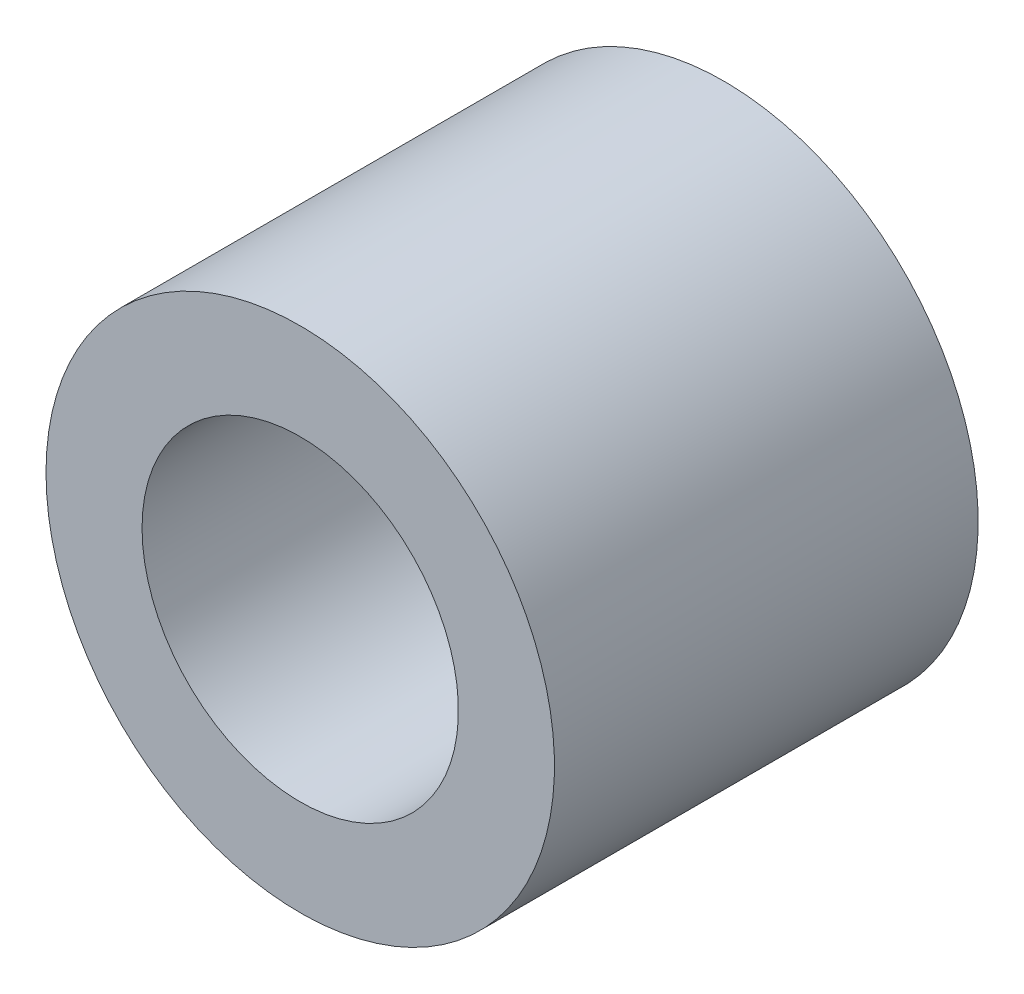
ISO-10303-21;
HEADER;
FILE_DESCRIPTION(('STEP AP214'),'2;1');
FILE_NAME('part.step','',(''),(''),'','','');
FILE_SCHEMA(('AUTOMOTIVE_DESIGN { 1 0 10303 214 1 1 1 1 }'));
ENDSEC;
DATA;
#1=APPLICATION_CONTEXT('core data for automotive mechanical design processes');
#2=APPLICATION_PROTOCOL_DEFINITION('international standard','automotive_design',2000,#1);
#3=PRODUCT_CONTEXT('',#1,'mechanical');
#4=PRODUCT('Part','Part','',(#3));
#5=PRODUCT_RELATED_PRODUCT_CATEGORY('part','',(#4));
#6=PRODUCT_DEFINITION_FORMATION('','',#4);
#7=PRODUCT_DEFINITION_CONTEXT('part definition',#1,'design');
#8=PRODUCT_DEFINITION('design','',#6,#7);
#9=PRODUCT_DEFINITION_SHAPE('','',#8);
#10=(LENGTH_UNIT() NAMED_UNIT(*) SI_UNIT(.MILLI.,.METRE.));
#11=(NAMED_UNIT(*) PLANE_ANGLE_UNIT() SI_UNIT($,.RADIAN.));
#12=(NAMED_UNIT(*) SI_UNIT($,.STERADIAN.) SOLID_ANGLE_UNIT());
#13=UNCERTAINTY_MEASURE_WITH_UNIT(LENGTH_MEASURE(1.E-05),#10,'distance_accuracy_value','');
#14=(GEOMETRIC_REPRESENTATION_CONTEXT(3) GLOBAL_UNCERTAINTY_ASSIGNED_CONTEXT((#13)) GLOBAL_UNIT_ASSIGNED_CONTEXT((#10,
#11,#12)) REPRESENTATION_CONTEXT('',''));
#15=CARTESIAN_POINT('',(0.,0.,0.));
#16=DIRECTION('',(0.,0.,1.));
#17=DIRECTION('',(1.,0.,0.));
#18=AXIS2_PLACEMENT_3D('',#15,#16,#17);
#19=CARTESIAN_POINT('',(0.,0.,9.525));
#20=DIRECTION('',(0.,0.,1.));
#21=DIRECTION('',(1.,0.,0.));
#22=AXIS2_PLACEMENT_3D('',#19,#20,#21);
#23=PLANE('',#22);
#24=CARTESIAN_POINT('',(0.,0.,9.525));
#25=DIRECTION('',(0.,0.,1.));
#26=DIRECTION('',(1.,0.,0.));
#27=AXIS2_PLACEMENT_3D('',#24,#25,#26);
#28=CIRCLE('',#27,5.715);
#29=CARTESIAN_POINT('',(-5.715,0.,9.525));
#30=VERTEX_POINT('',#29);
#31=EDGE_CURVE('E10',#30,#30,#28,.T.);
#32=ORIENTED_EDGE('',*,*,#31,.T.);
#33=EDGE_LOOP('',(#32));
#34=FACE_BOUND('',#33,.T.);
#35=CARTESIAN_POINT('',(0.,0.,9.525));
#36=DIRECTION('',(0.,0.,1.));
#37=DIRECTION('',(1.,0.,0.));
#38=AXIS2_PLACEMENT_3D('',#35,#36,#37);
#39=CIRCLE('',#38,3.556);
#40=CARTESIAN_POINT('',(-3.556,0.,9.525));
#41=VERTEX_POINT('',#40);
#42=EDGE_CURVE('E45',#41,#41,#39,.T.);
#43=ORIENTED_EDGE('',*,*,#42,.F.);
#44=EDGE_LOOP('',(#43));
#45=FACE_BOUND('',#44,.T.);
#46=ADVANCED_FACE('F34',(#34,#45),#23,.T.);
#47=CARTESIAN_POINT('',(0.,0.,0.));
#48=DIRECTION('',(0.,0.,1.));
#49=DIRECTION('',(1.,0.,0.));
#50=AXIS2_PLACEMENT_3D('',#47,#48,#49);
#51=PLANE('',#50);
#52=CARTESIAN_POINT('',(0.,0.,0.));
#53=DIRECTION('',(0.,0.,1.));
#54=DIRECTION('',(1.,0.,0.));
#55=AXIS2_PLACEMENT_3D('',#52,#53,#54);
#56=CIRCLE('',#55,5.715);
#57=CARTESIAN_POINT('',(-5.715,0.,0.));
#58=VERTEX_POINT('',#57);
#59=EDGE_CURVE('E38',#58,#58,#56,.T.);
#60=ORIENTED_EDGE('',*,*,#59,.F.);
#61=EDGE_LOOP('',(#60));
#62=FACE_BOUND('',#61,.T.);
#63=CARTESIAN_POINT('',(0.,0.,0.));
#64=DIRECTION('',(0.,0.,1.));
#65=DIRECTION('',(1.,0.,0.));
#66=AXIS2_PLACEMENT_3D('',#63,#64,#65);
#67=CIRCLE('',#66,3.556);
#68=CARTESIAN_POINT('',(-3.556,0.,0.));
#69=VERTEX_POINT('',#68);
#70=EDGE_CURVE('E47',#69,#69,#67,.T.);
#71=ORIENTED_EDGE('',*,*,#70,.T.);
#72=EDGE_LOOP('',(#71));
#73=FACE_BOUND('',#72,.T.);
#74=ADVANCED_FACE('F57',(#62,#73),#51,.F.);
#75=CARTESIAN_POINT('',(0.,0.,9.525));
#76=DIRECTION('',(0.,0.,-1.));
#77=DIRECTION('',(-1.,0.,0.));
#78=AXIS2_PLACEMENT_3D('',#75,#76,#77);
#79=CYLINDRICAL_SURFACE('',#78,5.715);
#80=CARTESIAN_POINT('',(-5.715,0.,9.525));
#81=CARTESIAN_POINT('',(-5.715,0.,9.42578125));
#82=CARTESIAN_POINT('',(-5.715,0.,9.3265625));
#83=CARTESIAN_POINT('',(-5.715,0.,9.128125));
#84=CARTESIAN_POINT('',(-5.715,0.,9.02890625));
#85=CARTESIAN_POINT('',(-5.715,0.,8.83046875));
#86=CARTESIAN_POINT('',(-5.715,0.,8.73125));
#87=CARTESIAN_POINT('',(-5.715,0.,8.5328125));
#88=CARTESIAN_POINT('',(-5.715,0.,8.43359375));
#89=CARTESIAN_POINT('',(-5.715,0.,8.23515625));
#90=CARTESIAN_POINT('',(-5.715,0.,8.1359375));
#91=CARTESIAN_POINT('',(-5.715,0.,7.9375));
#92=CARTESIAN_POINT('',(-5.715,0.,7.83828125));
#93=CARTESIAN_POINT('',(-5.715,0.,7.63984375));
#94=CARTESIAN_POINT('',(-5.715,0.,7.540625));
#95=CARTESIAN_POINT('',(-5.715,0.,7.3421875));
#96=CARTESIAN_POINT('',(-5.715,0.,7.24296875));
#97=CARTESIAN_POINT('',(-5.715,0.,7.04453125));
#98=CARTESIAN_POINT('',(-5.715,0.,6.9453125));
#99=CARTESIAN_POINT('',(-5.715,0.,6.746875));
#100=CARTESIAN_POINT('',(-5.715,0.,6.64765625));
#101=CARTESIAN_POINT('',(-5.715,0.,6.44921875));
#102=CARTESIAN_POINT('',(-5.715,0.,6.35));
#103=CARTESIAN_POINT('',(-5.715,0.,6.1515625));
#104=CARTESIAN_POINT('',(-5.715,0.,6.05234375));
#105=CARTESIAN_POINT('',(-5.715,0.,5.85390625));
#106=CARTESIAN_POINT('',(-5.715,0.,5.7546875));
#107=CARTESIAN_POINT('',(-5.715,0.,5.55625));
#108=CARTESIAN_POINT('',(-5.715,0.,5.45703125));
#109=CARTESIAN_POINT('',(-5.715,0.,5.25859375));
#110=CARTESIAN_POINT('',(-5.715,0.,5.159375));
#111=CARTESIAN_POINT('',(-5.715,0.,4.9609375));
#112=CARTESIAN_POINT('',(-5.715,0.,4.86171875));
#113=CARTESIAN_POINT('',(-5.715,0.,4.66328125));
#114=CARTESIAN_POINT('',(-5.715,0.,4.5640625));
#115=CARTESIAN_POINT('',(-5.715,0.,4.365625));
#116=CARTESIAN_POINT('',(-5.715,0.,4.26640625));
#117=CARTESIAN_POINT('',(-5.715,0.,4.06796875));
#118=CARTESIAN_POINT('',(-5.715,0.,3.96875));
#119=CARTESIAN_POINT('',(-5.715,0.,3.7703125));
#120=CARTESIAN_POINT('',(-5.715,0.,3.67109375));
#121=CARTESIAN_POINT('',(-5.715,0.,3.47265625));
#122=CARTESIAN_POINT('',(-5.715,0.,3.3734375));
#123=CARTESIAN_POINT('',(-5.715,0.,3.175));
#124=CARTESIAN_POINT('',(-5.715,0.,3.07578125));
#125=CARTESIAN_POINT('',(-5.715,0.,2.87734375));
#126=CARTESIAN_POINT('',(-5.715,0.,2.778125));
#127=CARTESIAN_POINT('',(-5.715,0.,2.5796875));
#128=CARTESIAN_POINT('',(-5.715,0.,2.48046875));
#129=CARTESIAN_POINT('',(-5.715,0.,2.28203125));
#130=CARTESIAN_POINT('',(-5.715,0.,2.1828125));
#131=CARTESIAN_POINT('',(-5.715,0.,1.984375));
#132=CARTESIAN_POINT('',(-5.715,0.,1.88515625));
#133=CARTESIAN_POINT('',(-5.715,0.,1.68671875));
#134=CARTESIAN_POINT('',(-5.715,0.,1.5875));
#135=CARTESIAN_POINT('',(-5.715,0.,1.3890625));
#136=CARTESIAN_POINT('',(-5.715,0.,1.28984375));
#137=CARTESIAN_POINT('',(-5.715,0.,1.09140625));
#138=CARTESIAN_POINT('',(-5.715,0.,0.992187500000001));
#139=CARTESIAN_POINT('',(-5.715,0.,0.793750000000001));
#140=CARTESIAN_POINT('',(-5.715,0.,0.69453125));
#141=CARTESIAN_POINT('',(-5.715,0.,0.49609375));
#142=CARTESIAN_POINT('',(-5.715,0.,0.396875));
#143=CARTESIAN_POINT('',(-5.715,0.,0.1984375));
#144=CARTESIAN_POINT('',(-5.715,0.,0.0992187500000001));
#145=CARTESIAN_POINT('',(-5.715,0.,0.));
#146=B_SPLINE_CURVE_WITH_KNOTS('',3,(#80,#81,#82,#83,#84,#85,#86,#87,#88,#89,#90,#91,#92,#93,
#94,#95,#96,#97,#98,#99,#100,#101,#102,#103,#104,#105,#106,#107,#108,#109,#110,#111,#112,#113,
#114,#115,#116,#117,#118,#119,#120,#121,#122,#123,#124,#125,#126,#127,#128,#129,#130,#131,#132,
#133,#134,#135,#136,#137,#138,#139,#140,#141,#142,#143,#144,#145),.UNSPECIFIED.,.F.,.F.,(4,2,2,
2,2,2,2,2,2,2,2,2,2,2,2,2,2,2,2,2,2,2,2,2,2,2,2,2,2,2,2,2,4),(0.,0.297656249999998,
0.595312499999999,0.892968749999999,1.190625,1.48828125,1.7859375,2.08359375,2.38125,2.67890625,
2.9765625,3.27421875,3.571875,3.86953125,4.1671875,4.46484375,4.7625,5.06015625,5.3578125,
5.65546875,5.953125,6.25078125,6.5484375,6.84609375,7.14375,7.44140625,7.7390625,8.03671875,
8.334375,8.63203125,8.9296875,9.22734375,9.525),.UNSPECIFIED.);
#147=EDGE_CURVE('BSEAM36',#30,#58,#146,.T.);
#148=ORIENTED_EDGE('',*,*,#31,.F.);
#149=ORIENTED_EDGE('',*,*,#59,.T.);
#150=ORIENTED_EDGE('',*,*,#147,.T.);
#151=ORIENTED_EDGE('',*,*,#147,.F.);
#152=EDGE_LOOP('',(#148,#150,#149,#151));
#153=FACE_BOUND('',#152,.T.);
#154=ADVANCED_FACE('F36',(#153),#79,.T.);
#155=CARTESIAN_POINT('',(0.,0.,9.525));
#156=DIRECTION('',(0.,0.,-1.));
#157=DIRECTION('',(-1.,0.,0.));
#158=AXIS2_PLACEMENT_3D('',#155,#156,#157);
#159=CYLINDRICAL_SURFACE('',#158,3.556);
#160=CARTESIAN_POINT('',(-3.556,0.,9.525));
#161=CARTESIAN_POINT('',(-3.556,0.,9.42578125));
#162=CARTESIAN_POINT('',(-3.556,0.,9.3265625));
#163=CARTESIAN_POINT('',(-3.556,0.,9.128125));
#164=CARTESIAN_POINT('',(-3.556,0.,9.02890625));
#165=CARTESIAN_POINT('',(-3.556,0.,8.83046875));
#166=CARTESIAN_POINT('',(-3.556,0.,8.73125));
#167=CARTESIAN_POINT('',(-3.556,0.,8.5328125));
#168=CARTESIAN_POINT('',(-3.556,0.,8.43359375));
#169=CARTESIAN_POINT('',(-3.556,0.,8.23515625));
#170=CARTESIAN_POINT('',(-3.556,0.,8.1359375));
#171=CARTESIAN_POINT('',(-3.556,0.,7.9375));
#172=CARTESIAN_POINT('',(-3.556,0.,7.83828125));
#173=CARTESIAN_POINT('',(-3.556,0.,7.63984375));
#174=CARTESIAN_POINT('',(-3.556,0.,7.540625));
#175=CARTESIAN_POINT('',(-3.556,0.,7.3421875));
#176=CARTESIAN_POINT('',(-3.556,0.,7.24296875));
#177=CARTESIAN_POINT('',(-3.556,0.,7.04453125));
#178=CARTESIAN_POINT('',(-3.556,0.,6.9453125));
#179=CARTESIAN_POINT('',(-3.556,0.,6.746875));
#180=CARTESIAN_POINT('',(-3.556,0.,6.64765625));
#181=CARTESIAN_POINT('',(-3.556,0.,6.44921875));
#182=CARTESIAN_POINT('',(-3.556,0.,6.35));
#183=CARTESIAN_POINT('',(-3.556,0.,6.1515625));
#184=CARTESIAN_POINT('',(-3.556,0.,6.05234375));
#185=CARTESIAN_POINT('',(-3.556,0.,5.85390625));
#186=CARTESIAN_POINT('',(-3.556,0.,5.7546875));
#187=CARTESIAN_POINT('',(-3.556,0.,5.55625));
#188=CARTESIAN_POINT('',(-3.556,0.,5.45703125));
#189=CARTESIAN_POINT('',(-3.556,0.,5.25859375));
#190=CARTESIAN_POINT('',(-3.556,0.,5.159375));
#191=CARTESIAN_POINT('',(-3.556,0.,4.9609375));
#192=CARTESIAN_POINT('',(-3.556,0.,4.86171875));
#193=CARTESIAN_POINT('',(-3.556,0.,4.66328125));
#194=CARTESIAN_POINT('',(-3.556,0.,4.5640625));
#195=CARTESIAN_POINT('',(-3.556,0.,4.365625));
#196=CARTESIAN_POINT('',(-3.556,0.,4.26640625));
#197=CARTESIAN_POINT('',(-3.556,0.,4.06796875));
#198=CARTESIAN_POINT('',(-3.556,0.,3.96875));
#199=CARTESIAN_POINT('',(-3.556,0.,3.7703125));
#200=CARTESIAN_POINT('',(-3.556,0.,3.67109375));
#201=CARTESIAN_POINT('',(-3.556,0.,3.47265625));
#202=CARTESIAN_POINT('',(-3.556,0.,3.3734375));
#203=CARTESIAN_POINT('',(-3.556,0.,3.175));
#204=CARTESIAN_POINT('',(-3.556,0.,3.07578125));
#205=CARTESIAN_POINT('',(-3.556,0.,2.87734375));
#206=CARTESIAN_POINT('',(-3.556,0.,2.778125));
#207=CARTESIAN_POINT('',(-3.556,0.,2.5796875));
#208=CARTESIAN_POINT('',(-3.556,0.,2.48046875));
#209=CARTESIAN_POINT('',(-3.556,0.,2.28203125));
#210=CARTESIAN_POINT('',(-3.556,0.,2.1828125));
#211=CARTESIAN_POINT('',(-3.556,0.,1.984375));
#212=CARTESIAN_POINT('',(-3.556,0.,1.88515625));
#213=CARTESIAN_POINT('',(-3.556,0.,1.68671875));
#214=CARTESIAN_POINT('',(-3.556,0.,1.5875));
#215=CARTESIAN_POINT('',(-3.556,0.,1.3890625));
#216=CARTESIAN_POINT('',(-3.556,0.,1.28984375));
#217=CARTESIAN_POINT('',(-3.556,0.,1.09140625));
#218=CARTESIAN_POINT('',(-3.556,0.,0.992187500000001));
#219=CARTESIAN_POINT('',(-3.556,0.,0.793750000000001));
#220=CARTESIAN_POINT('',(-3.556,0.,0.69453125));
#221=CARTESIAN_POINT('',(-3.556,0.,0.49609375));
#222=CARTESIAN_POINT('',(-3.556,0.,0.396875));
#223=CARTESIAN_POINT('',(-3.556,0.,0.1984375));
#224=CARTESIAN_POINT('',(-3.556,0.,0.0992187500000001));
#225=CARTESIAN_POINT('',(-3.556,0.,0.));
#226=B_SPLINE_CURVE_WITH_KNOTS('',3,(#160,#161,#162,#163,#164,#165,#166,#167,#168,#169,#170,
#171,#172,#173,#174,#175,#176,#177,#178,#179,#180,#181,#182,#183,#184,#185,#186,#187,#188,#189,
#190,#191,#192,#193,#194,#195,#196,#197,#198,#199,#200,#201,#202,#203,#204,#205,#206,#207,#208,
#209,#210,#211,#212,#213,#214,#215,#216,#217,#218,#219,#220,#221,#222,#223,#224,#225),
.UNSPECIFIED.,.F.,.F.,(4,2,2,2,2,2,2,2,2,2,2,2,2,2,2,2,2,2,2,2,2,2,2,2,2,2,2,2,2,2,2,2,4),(0.,
0.29765625,0.5953125,0.892968750000001,1.190625,1.48828125,1.7859375,2.08359375,2.38125,
2.67890625,2.9765625,3.27421875,3.571875,3.86953125,4.1671875,4.46484375,4.7625,5.06015625,
5.3578125,5.65546875,5.953125,6.25078125,6.5484375,6.84609375,7.14375,7.44140625,7.7390625,
8.03671875,8.334375,8.63203125,8.9296875,9.22734375,9.525),.UNSPECIFIED.);
#227=EDGE_CURVE('BSEAM53',#41,#69,#226,.T.);
#228=ORIENTED_EDGE('',*,*,#42,.T.);
#229=ORIENTED_EDGE('',*,*,#70,.F.);
#230=ORIENTED_EDGE('',*,*,#227,.T.);
#231=ORIENTED_EDGE('',*,*,#227,.F.);
#232=EDGE_LOOP('',(#228,#230,#229,#231));
#233=FACE_BOUND('',#232,.T.);
#234=ADVANCED_FACE('F53',(#233),#159,.F.);
#235=CLOSED_SHELL('',(#46,#74,#154,#234));
#236=MANIFOLD_SOLID_BREP('B2',#235);
#237=ADVANCED_BREP_SHAPE_REPRESENTATION('',(#18,#236),#14);
#238=SHAPE_DEFINITION_REPRESENTATION(#9,#237);
ENDSEC;
END-ISO-10303-21;
